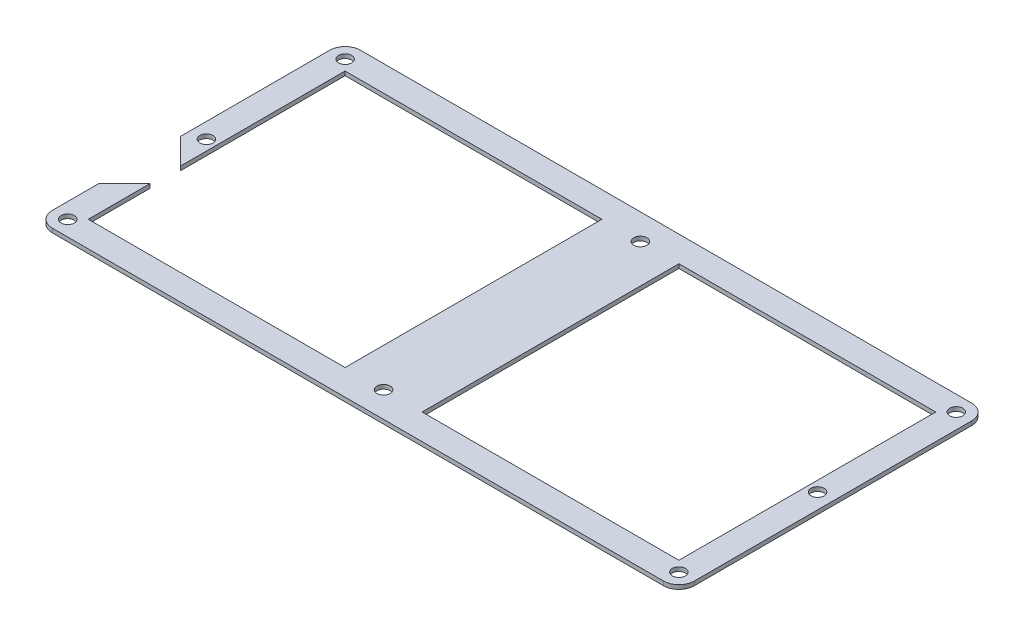
ISO-10303-21;
HEADER;
FILE_DESCRIPTION(('STEP AP214'),'2;1');
FILE_NAME('part.step','',(''),(''),'','','');
FILE_SCHEMA(('AUTOMOTIVE_DESIGN { 1 0 10303 214 1 1 1 1 }'));
ENDSEC;
DATA;
#1=APPLICATION_CONTEXT('core data for automotive mechanical design processes');
#2=APPLICATION_PROTOCOL_DEFINITION('international standard','automotive_design',2000,#1);
#3=PRODUCT_CONTEXT('',#1,'mechanical');
#4=PRODUCT('Part','Part','',(#3));
#5=PRODUCT_RELATED_PRODUCT_CATEGORY('part','',(#4));
#6=PRODUCT_DEFINITION_FORMATION('','',#4);
#7=PRODUCT_DEFINITION_CONTEXT('part definition',#1,'design');
#8=PRODUCT_DEFINITION('design','',#6,#7);
#9=PRODUCT_DEFINITION_SHAPE('','',#8);
#10=(LENGTH_UNIT() NAMED_UNIT(*) SI_UNIT(.MILLI.,.METRE.));
#11=(NAMED_UNIT(*) PLANE_ANGLE_UNIT() SI_UNIT($,.RADIAN.));
#12=(NAMED_UNIT(*) SI_UNIT($,.STERADIAN.) SOLID_ANGLE_UNIT());
#13=UNCERTAINTY_MEASURE_WITH_UNIT(LENGTH_MEASURE(1.E-05),#10,'distance_accuracy_value','');
#14=(GEOMETRIC_REPRESENTATION_CONTEXT(3) GLOBAL_UNCERTAINTY_ASSIGNED_CONTEXT((#13)) GLOBAL_UNIT_ASSIGNED_CONTEXT((#10,
#11,#12)) REPRESENTATION_CONTEXT('',''));
#15=CARTESIAN_POINT('',(0.,0.,0.));
#16=DIRECTION('',(0.,0.,1.));
#17=DIRECTION('',(1.,0.,0.));
#18=AXIS2_PLACEMENT_3D('',#15,#16,#17);
#19=CARTESIAN_POINT('',(19.4956943205761,1.6,-122.619803606918));
#20=DIRECTION('',(0.,1.,0.));
#21=DIRECTION('',(0.,0.,1.));
#22=AXIS2_PLACEMENT_3D('',#19,#20,#21);
#23=PLANE('',#22);
#24=CARTESIAN_POINT('',(257.495694320576,1.6,-68.6198036069182));
#25=DIRECTION('',(0.,1.,0.));
#26=DIRECTION('',(0.,0.,1.));
#27=AXIS2_PLACEMENT_3D('',#24,#25,#26);
#28=CIRCLE('',#27,2.55);
#29=CARTESIAN_POINT('',(257.495694320576,1.6,-66.0698036069182));
#30=VERTEX_POINT('',#29);
#31=EDGE_CURVE('E671',#30,#30,#28,.T.);
#32=ORIENTED_EDGE('',*,*,#31,.F.);
#33=EDGE_LOOP('',(#32));
#34=FACE_BOUND('',#33,.T.);
#35=CARTESIAN_POINT('',(257.495694320576,1.6,-14.6198036069181));
#36=DIRECTION('',(0.,1.,0.));
#37=DIRECTION('',(0.,0.,1.));
#38=AXIS2_PLACEMENT_3D('',#35,#36,#37);
#39=CIRCLE('',#38,2.5499999999995);
#40=CARTESIAN_POINT('',(257.495694320576,1.6,-12.0698036069186));
#41=VERTEX_POINT('',#40);
#42=EDGE_CURVE('E683',#41,#41,#39,.T.);
#43=ORIENTED_EDGE('',*,*,#42,.F.);
#44=EDGE_LOOP('',(#43));
#45=FACE_BOUND('',#44,.T.);
#46=CARTESIAN_POINT('',(138.495694320576,1.6,-118.619803606918));
#47=DIRECTION('',(0.,1.,0.));
#48=DIRECTION('',(0.,0.,1.));
#49=AXIS2_PLACEMENT_3D('',#46,#47,#48);
#50=CIRCLE('',#49,2.55);
#51=CARTESIAN_POINT('',(138.495694320576,1.6,-116.069803606918));
#52=VERTEX_POINT('',#51);
#53=EDGE_CURVE('E695',#52,#52,#50,.T.);
#54=ORIENTED_EDGE('',*,*,#53,.F.);
#55=EDGE_LOOP('',(#54));
#56=FACE_BOUND('',#55,.T.);
#57=CARTESIAN_POINT('',(19.4956943205761,1.6,-122.619803606918));
#58=DIRECTION('',(0.,1.,0.));
#59=DIRECTION('',(0.,0.,1.));
#60=AXIS2_PLACEMENT_3D('',#57,#58,#59);
#61=CIRCLE('',#60,2.55000000000046);
#62=CARTESIAN_POINT('',(19.4956943205761,1.6,-120.069803606918));
#63=VERTEX_POINT('',#62);
#64=EDGE_CURVE('E201',#63,#63,#61,.T.);
#65=ORIENTED_EDGE('',*,*,#64,.F.);
#66=EDGE_LOOP('',(#65));
#67=FACE_BOUND('',#66,.T.);
#68=DIRECTION('',(0.70710678118654,0.,0.707106781186555));
#69=VECTOR('',#68,1.);
#70=CARTESIAN_POINT('',(23.4956943205761,1.6,-54.6198036069181));
#71=LINE('',#70,#69);
#72=CARTESIAN_POINT('',(13.4956943205761,1.6,-64.6198036069184));
#73=VERTEX_POINT('',#72);
#74=CARTESIAN_POINT('',(23.4956943205761,1.6,-54.6198036069181));
#75=VERTEX_POINT('',#74);
#76=EDGE_CURVE('E211',#73,#75,#71,.T.);
#77=ORIENTED_EDGE('',*,*,#76,.T.);
#78=DIRECTION('',(0.,0.,-1.));
#79=VECTOR('',#78,1.);
#80=CARTESIAN_POINT('',(23.4956943205761,1.6,-54.6198036069181));
#81=LINE('',#80,#79);
#82=CARTESIAN_POINT('',(23.4956943205761,1.6,-118.619803606918));
#83=VERTEX_POINT('',#82);
#84=EDGE_CURVE('E214',#75,#83,#81,.T.);
#85=ORIENTED_EDGE('',*,*,#84,.T.);
#86=DIRECTION('',(1.,0.,0.));
#87=VECTOR('',#86,1.);
#88=CARTESIAN_POINT('',(23.4956943205761,1.6,-118.619803606918));
#89=LINE('',#88,#87);
#90=CARTESIAN_POINT('',(123.495694320576,1.6,-118.619803606918));
#91=VERTEX_POINT('',#90);
#92=EDGE_CURVE('E217',#83,#91,#89,.T.);
#93=ORIENTED_EDGE('',*,*,#92,.T.);
#94=DIRECTION('',(0.,0.,1.));
#95=VECTOR('',#94,1.);
#96=CARTESIAN_POINT('',(123.495694320576,1.6,-118.619803606918));
#97=LINE('',#96,#95);
#98=CARTESIAN_POINT('',(123.495694320576,1.6,-18.6198036069181));
#99=VERTEX_POINT('',#98);
#100=EDGE_CURVE('E219',#91,#99,#97,.T.);
#101=ORIENTED_EDGE('',*,*,#100,.T.);
#102=DIRECTION('',(-1.,0.,0.));
#103=VECTOR('',#102,1.);
#104=CARTESIAN_POINT('',(123.495694320576,1.6,-18.6198036069181));
#105=LINE('',#104,#103);
#106=CARTESIAN_POINT('',(23.4956943205761,1.6,-18.6198036069181));
#107=VERTEX_POINT('',#106);
#108=EDGE_CURVE('E221',#99,#107,#105,.T.);
#109=ORIENTED_EDGE('',*,*,#108,.T.);
#110=DIRECTION('',(0.,0.,-1.));
#111=VECTOR('',#110,1.);
#112=CARTESIAN_POINT('',(23.4956943205761,1.6,-18.6198036069181));
#113=LINE('',#112,#111);
#114=CARTESIAN_POINT('',(23.4956943205761,1.6,-42.6198036069181));
#115=VERTEX_POINT('',#114);
#116=EDGE_CURVE('E223',#107,#115,#113,.T.);
#117=ORIENTED_EDGE('',*,*,#116,.T.);
#118=DIRECTION('',(-0.70710678118654,0.,0.707106781186555));
#119=VECTOR('',#118,1.);
#120=CARTESIAN_POINT('',(23.4956943205761,1.6,-42.6198036069181));
#121=LINE('',#120,#119);
#122=CARTESIAN_POINT('',(13.4956943205761,1.6,-32.6198036069179));
#123=VERTEX_POINT('',#122);
#124=EDGE_CURVE('E225',#115,#123,#121,.T.);
#125=ORIENTED_EDGE('',*,*,#124,.T.);
#126=DIRECTION('',(0.,0.,1.));
#127=VECTOR('',#126,1.);
#128=CARTESIAN_POINT('',(13.4956943205761,1.6,-14.6198036069181));
#129=LINE('',#128,#127);
#130=CARTESIAN_POINT('',(13.4956943205762,1.6,-14.6198036069181));
#131=VERTEX_POINT('',#130);
#132=EDGE_CURVE('E227',#123,#131,#129,.T.);
#133=ORIENTED_EDGE('',*,*,#132,.T.);
#134=CARTESIAN_POINT('',(19.4956943205761,1.6,-14.6198036069181));
#135=DIRECTION('',(0.,1.,0.));
#136=DIRECTION('',(0.,0.,1.));
#137=AXIS2_PLACEMENT_3D('',#134,#135,#136);
#138=CIRCLE('',#137,6.);
#139=CARTESIAN_POINT('',(19.4956943205761,1.6,-8.61980360691814));
#140=VERTEX_POINT('',#139);
#141=EDGE_CURVE('E229',#131,#140,#138,.T.);
#142=ORIENTED_EDGE('',*,*,#141,.T.);
#143=DIRECTION('',(1.,0.,0.));
#144=VECTOR('',#143,1.);
#145=CARTESIAN_POINT('',(257.495694320576,1.6,-8.61980360691814));
#146=LINE('',#145,#144);
#147=CARTESIAN_POINT('',(257.495694320576,1.6,-8.61980360691814));
#148=VERTEX_POINT('',#147);
#149=EDGE_CURVE('E231',#140,#148,#146,.T.);
#150=ORIENTED_EDGE('',*,*,#149,.T.);
#151=CARTESIAN_POINT('',(257.495694320576,1.6,-14.6198036069181));
#152=DIRECTION('',(0.,1.,0.));
#153=DIRECTION('',(0.,0.,1.));
#154=AXIS2_PLACEMENT_3D('',#151,#152,#153);
#155=CIRCLE('',#154,6.);
#156=CARTESIAN_POINT('',(263.495694320576,1.6,-14.6198036069181));
#157=VERTEX_POINT('',#156);
#158=EDGE_CURVE('E233',#148,#157,#155,.T.);
#159=ORIENTED_EDGE('',*,*,#158,.T.);
#160=DIRECTION('',(0.,0.,-1.));
#161=VECTOR('',#160,1.);
#162=CARTESIAN_POINT('',(263.495694320576,1.6,-122.619803606918));
#163=LINE('',#162,#161);
#164=CARTESIAN_POINT('',(263.495694320576,1.6,-122.619803606918));
#165=VERTEX_POINT('',#164);
#166=EDGE_CURVE('E235',#157,#165,#163,.T.);
#167=ORIENTED_EDGE('',*,*,#166,.T.);
#168=CARTESIAN_POINT('',(257.495694320576,1.6,-122.619803606918));
#169=DIRECTION('',(0.,1.,0.));
#170=DIRECTION('',(0.,0.,1.));
#171=AXIS2_PLACEMENT_3D('',#168,#169,#170);
#172=CIRCLE('',#171,6.00000000000001);
#173=CARTESIAN_POINT('',(257.495694320576,1.6,-128.619803606918));
#174=VERTEX_POINT('',#173);
#175=EDGE_CURVE('E237',#165,#174,#172,.T.);
#176=ORIENTED_EDGE('',*,*,#175,.T.);
#177=DIRECTION('',(-1.,0.,0.));
#178=VECTOR('',#177,1.);
#179=CARTESIAN_POINT('',(19.4956943205761,1.6,-128.619803606918));
#180=LINE('',#179,#178);
#181=CARTESIAN_POINT('',(19.4956943205761,1.6,-128.619803606918));
#182=VERTEX_POINT('',#181);
#183=EDGE_CURVE('E239',#174,#182,#180,.T.);
#184=ORIENTED_EDGE('',*,*,#183,.T.);
#185=CARTESIAN_POINT('',(19.4956943205761,1.6,-122.619803606918));
#186=DIRECTION('',(0.,1.,0.));
#187=DIRECTION('',(0.,0.,1.));
#188=AXIS2_PLACEMENT_3D('',#185,#186,#187);
#189=CIRCLE('',#188,6.);
#190=CARTESIAN_POINT('',(13.4956943205761,1.6,-122.619803606918));
#191=VERTEX_POINT('',#190);
#192=EDGE_CURVE('E241',#182,#191,#189,.T.);
#193=ORIENTED_EDGE('',*,*,#192,.T.);
#194=DIRECTION('',(0.,0.,1.));
#195=VECTOR('',#194,1.);
#196=CARTESIAN_POINT('',(13.4956943205761,1.6,-64.6198036069184));
#197=LINE('',#196,#195);
#198=EDGE_CURVE('E243',#191,#73,#197,.T.);
#199=ORIENTED_EDGE('',*,*,#198,.T.);
#200=EDGE_LOOP('',(#77,#85,#93,#101,#109,#117,#125,#133,#142,#150,#159,#167,#176,#184,#193,#199));
#201=FACE_BOUND('',#200,.T.);
#202=DIRECTION('',(-1.,0.,0.));
#203=VECTOR('',#202,1.);
#204=CARTESIAN_POINT('',(253.495694320576,1.6,-118.619803606918));
#205=LINE('',#204,#203);
#206=CARTESIAN_POINT('',(253.495694320576,1.6,-118.619803606918));
#207=VERTEX_POINT('',#206);
#208=CARTESIAN_POINT('',(153.495694320576,1.6,-118.619803606918));
#209=VERTEX_POINT('',#208);
#210=EDGE_CURVE('E180',#207,#209,#205,.T.);
#211=ORIENTED_EDGE('',*,*,#210,.F.);
#212=DIRECTION('',(0.,0.,-1.));
#213=VECTOR('',#212,1.);
#214=CARTESIAN_POINT('',(253.495694320576,1.6,-18.6198036069181));
#215=LINE('',#214,#213);
#216=CARTESIAN_POINT('',(253.495694320576,1.6,-18.6198036069181));
#217=VERTEX_POINT('',#216);
#218=EDGE_CURVE('E172',#217,#207,#215,.T.);
#219=ORIENTED_EDGE('',*,*,#218,.F.);
#220=DIRECTION('',(1.,0.,0.));
#221=VECTOR('',#220,1.);
#222=CARTESIAN_POINT('',(153.495694320576,1.6,-18.6198036069181));
#223=LINE('',#222,#221);
#224=CARTESIAN_POINT('',(153.495694320576,1.6,-18.6198036069181));
#225=VERTEX_POINT('',#224);
#226=EDGE_CURVE('E195',#225,#217,#223,.T.);
#227=ORIENTED_EDGE('',*,*,#226,.F.);
#228=DIRECTION('',(0.,0.,1.));
#229=VECTOR('',#228,1.);
#230=CARTESIAN_POINT('',(153.495694320576,1.6,-118.619803606918));
#231=LINE('',#230,#229);
#232=EDGE_CURVE('E193',#209,#225,#231,.T.);
#233=ORIENTED_EDGE('',*,*,#232,.F.);
#234=EDGE_LOOP('',(#211,#219,#227,#233));
#235=FACE_BOUND('',#234,.T.);
#236=CARTESIAN_POINT('',(257.495694320576,1.6,-122.619803606918));
#237=DIRECTION('',(0.,1.,0.));
#238=DIRECTION('',(0.,0.,1.));
#239=AXIS2_PLACEMENT_3D('',#236,#237,#238);
#240=CIRCLE('',#239,2.5499999999995);
#241=CARTESIAN_POINT('',(257.495694320576,1.6,-120.069803606919));
#242=VERTEX_POINT('',#241);
#243=EDGE_CURVE('E701',#242,#242,#240,.T.);
#244=ORIENTED_EDGE('',*,*,#243,.F.);
#245=EDGE_LOOP('',(#244));
#246=FACE_BOUND('',#245,.T.);
#247=CARTESIAN_POINT('',(19.4956943205761,1.6,-14.6198036069181));
#248=DIRECTION('',(0.,1.,0.));
#249=DIRECTION('',(0.,0.,1.));
#250=AXIS2_PLACEMENT_3D('',#247,#248,#249);
#251=CIRCLE('',#250,2.55000000000045);
#252=CARTESIAN_POINT('',(19.4956943205761,1.6,-12.0698036069177));
#253=VERTEX_POINT('',#252);
#254=EDGE_CURVE('E689',#253,#253,#251,.T.);
#255=ORIENTED_EDGE('',*,*,#254,.F.);
#256=EDGE_LOOP('',(#255));
#257=FACE_BOUND('',#256,.T.);
#258=CARTESIAN_POINT('',(138.495694320576,1.6,-18.6198036069181));
#259=DIRECTION('',(0.,1.,0.));
#260=DIRECTION('',(0.,0.,1.));
#261=AXIS2_PLACEMENT_3D('',#258,#259,#260);
#262=CIRCLE('',#261,2.55);
#263=CARTESIAN_POINT('',(138.495694320576,1.6,-16.0698036069181));
#264=VERTEX_POINT('',#263);
#265=EDGE_CURVE('E677',#264,#264,#262,.T.);
#266=ORIENTED_EDGE('',*,*,#265,.F.);
#267=EDGE_LOOP('',(#266));
#268=FACE_BOUND('',#267,.T.);
#269=CARTESIAN_POINT('',(19.4956943205766,1.6,-68.6198036069182));
#270=DIRECTION('',(0.,1.,0.));
#271=DIRECTION('',(0.,0.,1.));
#272=AXIS2_PLACEMENT_3D('',#269,#270,#271);
#273=CIRCLE('',#272,2.55);
#274=CARTESIAN_POINT('',(19.4956943205766,1.6,-66.0698036069182));
#275=VERTEX_POINT('',#274);
#276=EDGE_CURVE('E662',#275,#275,#273,.T.);
#277=ORIENTED_EDGE('',*,*,#276,.F.);
#278=EDGE_LOOP('',(#277));
#279=FACE_BOUND('',#278,.T.);
#280=ADVANCED_FACE('F35',(#34,#45,#56,#67,#201,#235,#246,#257,#268,#279),#23,.T.);
#281=CARTESIAN_POINT('',(19.4956943205761,0.,-122.619803606918));
#282=DIRECTION('',(0.,1.,0.));
#283=DIRECTION('',(0.,0.,1.));
#284=AXIS2_PLACEMENT_3D('',#281,#282,#283);
#285=PLANE('',#284);
#286=DIRECTION('',(0.70710678118654,0.,0.707106781186555));
#287=VECTOR('',#286,1.);
#288=CARTESIAN_POINT('',(23.4956943205761,0.,-54.6198036069181));
#289=LINE('',#288,#287);
#290=CARTESIAN_POINT('',(13.4956943205761,0.,-64.6198036069184));
#291=VERTEX_POINT('',#290);
#292=CARTESIAN_POINT('',(23.4956943205761,0.,-54.6198036069181));
#293=VERTEX_POINT('',#292);
#294=EDGE_CURVE('E188',#291,#293,#289,.T.);
#295=ORIENTED_EDGE('',*,*,#294,.F.);
#296=DIRECTION('',(0.,0.,1.));
#297=VECTOR('',#296,1.);
#298=CARTESIAN_POINT('',(13.4956943205761,0.,-64.6198036069184));
#299=LINE('',#298,#297);
#300=CARTESIAN_POINT('',(13.4956943205761,0.,-122.619803606918));
#301=VERTEX_POINT('',#300);
#302=EDGE_CURVE('E215',#301,#291,#299,.T.);
#303=ORIENTED_EDGE('',*,*,#302,.F.);
#304=CARTESIAN_POINT('',(19.4956943205761,0.,-122.619803606918));
#305=DIRECTION('',(0.,1.,0.));
#306=DIRECTION('',(0.,0.,1.));
#307=AXIS2_PLACEMENT_3D('',#304,#305,#306);
#308=CIRCLE('',#307,6.);
#309=CARTESIAN_POINT('',(19.4956943205761,0.,-128.619803606918));
#310=VERTEX_POINT('',#309);
#311=EDGE_CURVE('E274',#310,#301,#308,.T.);
#312=ORIENTED_EDGE('',*,*,#311,.F.);
#313=DIRECTION('',(-1.,0.,0.));
#314=VECTOR('',#313,1.);
#315=CARTESIAN_POINT('',(19.4956943205761,0.,-128.619803606918));
#316=LINE('',#315,#314);
#317=CARTESIAN_POINT('',(257.495694320576,0.,-128.619803606918));
#318=VERTEX_POINT('',#317);
#319=EDGE_CURVE('E272',#318,#310,#316,.T.);
#320=ORIENTED_EDGE('',*,*,#319,.F.);
#321=CARTESIAN_POINT('',(257.495694320576,0.,-122.619803606918));
#322=DIRECTION('',(0.,1.,0.));
#323=DIRECTION('',(0.,0.,1.));
#324=AXIS2_PLACEMENT_3D('',#321,#322,#323);
#325=CIRCLE('',#324,6.00000000000001);
#326=CARTESIAN_POINT('',(263.495694320576,0.,-122.619803606918));
#327=VERTEX_POINT('',#326);
#328=EDGE_CURVE('E270',#327,#318,#325,.T.);
#329=ORIENTED_EDGE('',*,*,#328,.F.);
#330=DIRECTION('',(0.,0.,-1.));
#331=VECTOR('',#330,1.);
#332=CARTESIAN_POINT('',(263.495694320576,0.,-122.619803606918));
#333=LINE('',#332,#331);
#334=CARTESIAN_POINT('',(263.495694320576,0.,-14.6198036069181));
#335=VERTEX_POINT('',#334);
#336=EDGE_CURVE('E268',#335,#327,#333,.T.);
#337=ORIENTED_EDGE('',*,*,#336,.F.);
#338=CARTESIAN_POINT('',(257.495694320576,0.,-14.6198036069181));
#339=DIRECTION('',(0.,1.,0.));
#340=DIRECTION('',(0.,0.,1.));
#341=AXIS2_PLACEMENT_3D('',#338,#339,#340);
#342=CIRCLE('',#341,6.);
#343=CARTESIAN_POINT('',(257.495694320576,0.,-8.61980360691814));
#344=VERTEX_POINT('',#343);
#345=EDGE_CURVE('E266',#344,#335,#342,.T.);
#346=ORIENTED_EDGE('',*,*,#345,.F.);
#347=DIRECTION('',(1.,0.,0.));
#348=VECTOR('',#347,1.);
#349=CARTESIAN_POINT('',(257.495694320576,0.,-8.61980360691814));
#350=LINE('',#349,#348);
#351=CARTESIAN_POINT('',(19.4956943205761,0.,-8.61980360691814));
#352=VERTEX_POINT('',#351);
#353=EDGE_CURVE('E264',#352,#344,#350,.T.);
#354=ORIENTED_EDGE('',*,*,#353,.F.);
#355=CARTESIAN_POINT('',(19.4956943205761,0.,-14.6198036069181));
#356=DIRECTION('',(0.,1.,0.));
#357=DIRECTION('',(0.,0.,1.));
#358=AXIS2_PLACEMENT_3D('',#355,#356,#357);
#359=CIRCLE('',#358,6.);
#360=CARTESIAN_POINT('',(13.4956943205762,0.,-14.6198036069181));
#361=VERTEX_POINT('',#360);
#362=EDGE_CURVE('E262',#361,#352,#359,.T.);
#363=ORIENTED_EDGE('',*,*,#362,.F.);
#364=DIRECTION('',(0.,0.,1.));
#365=VECTOR('',#364,1.);
#366=CARTESIAN_POINT('',(13.4956943205761,0.,-14.6198036069181));
#367=LINE('',#366,#365);
#368=CARTESIAN_POINT('',(13.4956943205761,0.,-32.6198036069179));
#369=VERTEX_POINT('',#368);
#370=EDGE_CURVE('E260',#369,#361,#367,.T.);
#371=ORIENTED_EDGE('',*,*,#370,.F.);
#372=DIRECTION('',(-0.70710678118654,0.,0.707106781186555));
#373=VECTOR('',#372,1.);
#374=CARTESIAN_POINT('',(23.4956943205761,0.,-42.6198036069181));
#375=LINE('',#374,#373);
#376=CARTESIAN_POINT('',(23.4956943205761,0.,-42.6198036069181));
#377=VERTEX_POINT('',#376);
#378=EDGE_CURVE('E258',#377,#369,#375,.T.);
#379=ORIENTED_EDGE('',*,*,#378,.F.);
#380=DIRECTION('',(0.,0.,-1.));
#381=VECTOR('',#380,1.);
#382=CARTESIAN_POINT('',(23.4956943205761,0.,-18.6198036069181));
#383=LINE('',#382,#381);
#384=CARTESIAN_POINT('',(23.4956943205761,0.,-18.6198036069181));
#385=VERTEX_POINT('',#384);
#386=EDGE_CURVE('E256',#385,#377,#383,.T.);
#387=ORIENTED_EDGE('',*,*,#386,.F.);
#388=DIRECTION('',(-1.,0.,0.));
#389=VECTOR('',#388,1.);
#390=CARTESIAN_POINT('',(123.495694320576,0.,-18.6198036069181));
#391=LINE('',#390,#389);
#392=CARTESIAN_POINT('',(123.495694320576,0.,-18.6198036069181));
#393=VERTEX_POINT('',#392);
#394=EDGE_CURVE('E254',#393,#385,#391,.T.);
#395=ORIENTED_EDGE('',*,*,#394,.F.);
#396=DIRECTION('',(0.,0.,1.));
#397=VECTOR('',#396,1.);
#398=CARTESIAN_POINT('',(123.495694320576,0.,-118.619803606918));
#399=LINE('',#398,#397);
#400=CARTESIAN_POINT('',(123.495694320576,0.,-118.619803606918));
#401=VERTEX_POINT('',#400);
#402=EDGE_CURVE('E252',#401,#393,#399,.T.);
#403=ORIENTED_EDGE('',*,*,#402,.F.);
#404=DIRECTION('',(1.,0.,0.));
#405=VECTOR('',#404,1.);
#406=CARTESIAN_POINT('',(23.4956943205761,0.,-118.619803606918));
#407=LINE('',#406,#405);
#408=CARTESIAN_POINT('',(23.4956943205761,0.,-118.619803606918));
#409=VERTEX_POINT('',#408);
#410=EDGE_CURVE('E250',#409,#401,#407,.T.);
#411=ORIENTED_EDGE('',*,*,#410,.F.);
#412=DIRECTION('',(0.,0.,-1.));
#413=VECTOR('',#412,1.);
#414=CARTESIAN_POINT('',(23.4956943205761,0.,-54.6198036069181));
#415=LINE('',#414,#413);
#416=EDGE_CURVE('E248',#293,#409,#415,.T.);
#417=ORIENTED_EDGE('',*,*,#416,.F.);
#418=EDGE_LOOP('',(#295,#303,#312,#320,#329,#337,#346,#354,#363,#371,#379,#387,#395,#403,#411,#417));
#419=FACE_BOUND('',#418,.T.);
#420=DIRECTION('',(0.,0.,-1.));
#421=VECTOR('',#420,1.);
#422=CARTESIAN_POINT('',(253.495694320576,0.,-18.6198036069181));
#423=LINE('',#422,#421);
#424=CARTESIAN_POINT('',(253.495694320576,0.,-18.6198036069181));
#425=VERTEX_POINT('',#424);
#426=CARTESIAN_POINT('',(253.495694320576,0.,-118.619803606918));
#427=VERTEX_POINT('',#426);
#428=EDGE_CURVE('E58',#425,#427,#423,.T.);
#429=ORIENTED_EDGE('',*,*,#428,.T.);
#430=DIRECTION('',(-1.,0.,0.));
#431=VECTOR('',#430,1.);
#432=CARTESIAN_POINT('',(253.495694320576,0.,-118.619803606918));
#433=LINE('',#432,#431);
#434=CARTESIAN_POINT('',(153.495694320576,0.,-118.619803606918));
#435=VERTEX_POINT('',#434);
#436=EDGE_CURVE('E187',#427,#435,#433,.T.);
#437=ORIENTED_EDGE('',*,*,#436,.T.);
#438=DIRECTION('',(0.,0.,1.));
#439=VECTOR('',#438,1.);
#440=CARTESIAN_POINT('',(153.495694320576,0.,-118.619803606918));
#441=LINE('',#440,#439);
#442=CARTESIAN_POINT('',(153.495694320576,0.,-18.6198036069181));
#443=VERTEX_POINT('',#442);
#444=EDGE_CURVE('E203',#435,#443,#441,.T.);
#445=ORIENTED_EDGE('',*,*,#444,.T.);
#446=DIRECTION('',(1.,0.,0.));
#447=VECTOR('',#446,1.);
#448=CARTESIAN_POINT('',(153.495694320576,0.,-18.6198036069181));
#449=LINE('',#448,#447);
#450=EDGE_CURVE('E181',#443,#425,#449,.T.);
#451=ORIENTED_EDGE('',*,*,#450,.T.);
#452=EDGE_LOOP('',(#429,#437,#445,#451));
#453=FACE_BOUND('',#452,.T.);
#454=CARTESIAN_POINT('',(19.4956943205761,0.,-122.619803606918));
#455=DIRECTION('',(0.,1.,0.));
#456=DIRECTION('',(0.,0.,1.));
#457=AXIS2_PLACEMENT_3D('',#454,#455,#456);
#458=CIRCLE('',#457,2.55000000000046);
#459=CARTESIAN_POINT('',(19.4956943205761,0.,-120.069803606918));
#460=VERTEX_POINT('',#459);
#461=EDGE_CURVE('E704',#460,#460,#458,.T.);
#462=ORIENTED_EDGE('',*,*,#461,.T.);
#463=EDGE_LOOP('',(#462));
#464=FACE_BOUND('',#463,.T.);
#465=CARTESIAN_POINT('',(257.495694320576,0.,-122.619803606918));
#466=DIRECTION('',(0.,1.,0.));
#467=DIRECTION('',(0.,0.,1.));
#468=AXIS2_PLACEMENT_3D('',#465,#466,#467);
#469=CIRCLE('',#468,2.5499999999995);
#470=CARTESIAN_POINT('',(257.495694320576,0.,-120.069803606919));
#471=VERTEX_POINT('',#470);
#472=EDGE_CURVE('E698',#471,#471,#469,.T.);
#473=ORIENTED_EDGE('',*,*,#472,.T.);
#474=EDGE_LOOP('',(#473));
#475=FACE_BOUND('',#474,.T.);
#476=CARTESIAN_POINT('',(138.495694320576,0.,-118.619803606918));
#477=DIRECTION('',(0.,1.,0.));
#478=DIRECTION('',(0.,0.,1.));
#479=AXIS2_PLACEMENT_3D('',#476,#477,#478);
#480=CIRCLE('',#479,2.55);
#481=CARTESIAN_POINT('',(138.495694320576,0.,-116.069803606918));
#482=VERTEX_POINT('',#481);
#483=EDGE_CURVE('E692',#482,#482,#480,.T.);
#484=ORIENTED_EDGE('',*,*,#483,.T.);
#485=EDGE_LOOP('',(#484));
#486=FACE_BOUND('',#485,.T.);
#487=CARTESIAN_POINT('',(19.4956943205761,0.,-14.6198036069181));
#488=DIRECTION('',(0.,1.,0.));
#489=DIRECTION('',(0.,0.,1.));
#490=AXIS2_PLACEMENT_3D('',#487,#488,#489);
#491=CIRCLE('',#490,2.55000000000045);
#492=CARTESIAN_POINT('',(19.4956943205761,0.,-12.0698036069177));
#493=VERTEX_POINT('',#492);
#494=EDGE_CURVE('E686',#493,#493,#491,.T.);
#495=ORIENTED_EDGE('',*,*,#494,.T.);
#496=EDGE_LOOP('',(#495));
#497=FACE_BOUND('',#496,.T.);
#498=CARTESIAN_POINT('',(257.495694320576,0.,-14.6198036069181));
#499=DIRECTION('',(0.,1.,0.));
#500=DIRECTION('',(0.,0.,1.));
#501=AXIS2_PLACEMENT_3D('',#498,#499,#500);
#502=CIRCLE('',#501,2.5499999999995);
#503=CARTESIAN_POINT('',(257.495694320576,0.,-12.0698036069186));
#504=VERTEX_POINT('',#503);
#505=EDGE_CURVE('E680',#504,#504,#502,.T.);
#506=ORIENTED_EDGE('',*,*,#505,.T.);
#507=EDGE_LOOP('',(#506));
#508=FACE_BOUND('',#507,.T.);
#509=CARTESIAN_POINT('',(138.495694320576,0.,-18.6198036069181));
#510=DIRECTION('',(0.,1.,0.));
#511=DIRECTION('',(0.,0.,1.));
#512=AXIS2_PLACEMENT_3D('',#509,#510,#511);
#513=CIRCLE('',#512,2.55);
#514=CARTESIAN_POINT('',(138.495694320576,0.,-16.0698036069181));
#515=VERTEX_POINT('',#514);
#516=EDGE_CURVE('E674',#515,#515,#513,.T.);
#517=ORIENTED_EDGE('',*,*,#516,.T.);
#518=EDGE_LOOP('',(#517));
#519=FACE_BOUND('',#518,.T.);
#520=CARTESIAN_POINT('',(257.495694320576,0.,-68.6198036069182));
#521=DIRECTION('',(0.,1.,0.));
#522=DIRECTION('',(0.,0.,1.));
#523=AXIS2_PLACEMENT_3D('',#520,#521,#522);
#524=CIRCLE('',#523,2.55);
#525=CARTESIAN_POINT('',(257.495694320576,0.,-66.0698036069182));
#526=VERTEX_POINT('',#525);
#527=EDGE_CURVE('E668',#526,#526,#524,.T.);
#528=ORIENTED_EDGE('',*,*,#527,.T.);
#529=EDGE_LOOP('',(#528));
#530=FACE_BOUND('',#529,.T.);
#531=CARTESIAN_POINT('',(19.4956943205766,0.,-68.6198036069182));
#532=DIRECTION('',(0.,1.,0.));
#533=DIRECTION('',(0.,0.,1.));
#534=AXIS2_PLACEMENT_3D('',#531,#532,#533);
#535=CIRCLE('',#534,2.55);
#536=CARTESIAN_POINT('',(19.4956943205766,0.,-66.0698036069182));
#537=VERTEX_POINT('',#536);
#538=EDGE_CURVE('E665',#537,#537,#535,.T.);
#539=ORIENTED_EDGE('',*,*,#538,.T.);
#540=EDGE_LOOP('',(#539));
#541=FACE_BOUND('',#540,.T.);
#542=ADVANCED_FACE('F328',(#419,#453,#464,#475,#486,#497,#508,#519,#530,#541),#285,.F.);
#543=CARTESIAN_POINT('',(23.4956943205761,1.6,-54.6198036069181));
#544=DIRECTION('',(0.707106781186555,0.,-0.70710678118654));
#545=DIRECTION('',(-0.70710678118654,0.,-0.707106781186555));
#546=AXIS2_PLACEMENT_3D('',#543,#544,#545);
#547=PLANE('',#546);
#548=ORIENTED_EDGE('',*,*,#294,.T.);
#549=DIRECTION('',(0.,-1.,0.));
#550=VECTOR('',#549,1.);
#551=CARTESIAN_POINT('',(23.4956943205761,1.6,-54.6198036069181));
#552=LINE('',#551,#550);
#553=EDGE_CURVE('E11',#75,#293,#552,.T.);
#554=ORIENTED_EDGE('',*,*,#553,.F.);
#555=ORIENTED_EDGE('',*,*,#76,.F.);
#556=DIRECTION('',(0.,-1.,0.));
#557=VECTOR('',#556,1.);
#558=CARTESIAN_POINT('',(13.4956943205761,1.6,-64.6198036069184));
#559=LINE('',#558,#557);
#560=EDGE_CURVE('E245',#73,#291,#559,.T.);
#561=ORIENTED_EDGE('',*,*,#560,.T.);
#562=EDGE_LOOP('',(#548,#554,#555,#561));
#563=FACE_BOUND('',#562,.T.);
#564=ADVANCED_FACE('F37',(#563),#547,.F.);
#565=CARTESIAN_POINT('',(23.4956943205761,1.6,-54.6198036069181));
#566=DIRECTION('',(-1.,0.,0.));
#567=DIRECTION('',(0.,0.,1.));
#568=AXIS2_PLACEMENT_3D('',#565,#566,#567);
#569=PLANE('',#568);
#570=ORIENTED_EDGE('',*,*,#416,.T.);
#571=DIRECTION('',(0.,-1.,0.));
#572=VECTOR('',#571,1.);
#573=CARTESIAN_POINT('',(23.4956943205761,1.6,-118.619803606918));
#574=LINE('',#573,#572);
#575=EDGE_CURVE('E43',#83,#409,#574,.T.);
#576=ORIENTED_EDGE('',*,*,#575,.F.);
#577=ORIENTED_EDGE('',*,*,#84,.F.);
#578=ORIENTED_EDGE('',*,*,#553,.T.);
#579=EDGE_LOOP('',(#570,#576,#577,#578));
#580=FACE_BOUND('',#579,.T.);
#581=ADVANCED_FACE('F345',(#580),#569,.F.);
#582=CARTESIAN_POINT('',(23.4956943205761,1.6,-118.619803606918));
#583=DIRECTION('',(0.,0.,-1.));
#584=DIRECTION('',(-1.,0.,0.));
#585=AXIS2_PLACEMENT_3D('',#582,#583,#584);
#586=PLANE('',#585);
#587=ORIENTED_EDGE('',*,*,#410,.T.);
#588=DIRECTION('',(0.,-1.,0.));
#589=VECTOR('',#588,1.);
#590=CARTESIAN_POINT('',(123.495694320576,1.6,-118.619803606918));
#591=LINE('',#590,#589);
#592=EDGE_CURVE('E315',#91,#401,#591,.T.);
#593=ORIENTED_EDGE('',*,*,#592,.F.);
#594=ORIENTED_EDGE('',*,*,#92,.F.);
#595=ORIENTED_EDGE('',*,*,#575,.T.);
#596=EDGE_LOOP('',(#587,#593,#594,#595));
#597=FACE_BOUND('',#596,.T.);
#598=ADVANCED_FACE('F322',(#597),#586,.F.);
#599=CARTESIAN_POINT('',(123.495694320576,1.6,-118.619803606918));
#600=DIRECTION('',(1.,0.,0.));
#601=DIRECTION('',(0.,0.,-1.));
#602=AXIS2_PLACEMENT_3D('',#599,#600,#601);
#603=PLANE('',#602);
#604=ORIENTED_EDGE('',*,*,#402,.T.);
#605=DIRECTION('',(0.,-1.,0.));
#606=VECTOR('',#605,1.);
#607=CARTESIAN_POINT('',(123.495694320576,1.6,-18.6198036069181));
#608=LINE('',#607,#606);
#609=EDGE_CURVE('E312',#99,#393,#608,.T.);
#610=ORIENTED_EDGE('',*,*,#609,.F.);
#611=ORIENTED_EDGE('',*,*,#100,.F.);
#612=ORIENTED_EDGE('',*,*,#592,.T.);
#613=EDGE_LOOP('',(#604,#610,#611,#612));
#614=FACE_BOUND('',#613,.T.);
#615=ADVANCED_FACE('F334',(#614),#603,.F.);
#616=CARTESIAN_POINT('',(123.495694320576,1.6,-18.6198036069181));
#617=DIRECTION('',(0.,0.,1.));
#618=DIRECTION('',(1.,0.,0.));
#619=AXIS2_PLACEMENT_3D('',#616,#617,#618);
#620=PLANE('',#619);
#621=ORIENTED_EDGE('',*,*,#394,.T.);
#622=DIRECTION('',(0.,-1.,0.));
#623=VECTOR('',#622,1.);
#624=CARTESIAN_POINT('',(23.4956943205761,1.6,-18.6198036069181));
#625=LINE('',#624,#623);
#626=EDGE_CURVE('E309',#107,#385,#625,.T.);
#627=ORIENTED_EDGE('',*,*,#626,.F.);
#628=ORIENTED_EDGE('',*,*,#108,.F.);
#629=ORIENTED_EDGE('',*,*,#609,.T.);
#630=EDGE_LOOP('',(#621,#627,#628,#629));
#631=FACE_BOUND('',#630,.T.);
#632=ADVANCED_FACE('F338',(#631),#620,.F.);
#633=CARTESIAN_POINT('',(23.4956943205761,1.6,-18.6198036069181));
#634=DIRECTION('',(-1.,0.,0.));
#635=DIRECTION('',(0.,0.,1.));
#636=AXIS2_PLACEMENT_3D('',#633,#634,#635);
#637=PLANE('',#636);
#638=ORIENTED_EDGE('',*,*,#386,.T.);
#639=DIRECTION('',(0.,-1.,0.));
#640=VECTOR('',#639,1.);
#641=CARTESIAN_POINT('',(23.4956943205761,1.6,-42.6198036069181));
#642=LINE('',#641,#640);
#643=EDGE_CURVE('E306',#115,#377,#642,.T.);
#644=ORIENTED_EDGE('',*,*,#643,.F.);
#645=ORIENTED_EDGE('',*,*,#116,.F.);
#646=ORIENTED_EDGE('',*,*,#626,.T.);
#647=EDGE_LOOP('',(#638,#644,#645,#646));
#648=FACE_BOUND('',#647,.T.);
#649=ADVANCED_FACE('F398',(#648),#637,.F.);
#650=CARTESIAN_POINT('',(23.4956943205761,1.6,-42.6198036069181));
#651=DIRECTION('',(0.707106781186555,0.,0.70710678118654));
#652=DIRECTION('',(0.70710678118654,0.,-0.707106781186555));
#653=AXIS2_PLACEMENT_3D('',#650,#651,#652);
#654=PLANE('',#653);
#655=ORIENTED_EDGE('',*,*,#378,.T.);
#656=DIRECTION('',(0.,-1.,0.));
#657=VECTOR('',#656,1.);
#658=CARTESIAN_POINT('',(13.4956943205761,1.6,-32.6198036069179));
#659=LINE('',#658,#657);
#660=EDGE_CURVE('E303',#123,#369,#659,.T.);
#661=ORIENTED_EDGE('',*,*,#660,.F.);
#662=ORIENTED_EDGE('',*,*,#124,.F.);
#663=ORIENTED_EDGE('',*,*,#643,.T.);
#664=EDGE_LOOP('',(#655,#661,#662,#663));
#665=FACE_BOUND('',#664,.T.);
#666=ADVANCED_FACE('F395',(#665),#654,.F.);
#667=CARTESIAN_POINT('',(13.4956943205761,1.6,-14.6198036069181));
#668=DIRECTION('',(1.,0.,0.));
#669=DIRECTION('',(0.,0.,-1.));
#670=AXIS2_PLACEMENT_3D('',#667,#668,#669);
#671=PLANE('',#670);
#672=ORIENTED_EDGE('',*,*,#370,.T.);
#673=DIRECTION('',(0.,-1.,0.));
#674=VECTOR('',#673,1.);
#675=CARTESIAN_POINT('',(13.4956943205762,1.6,-14.6198036069181));
#676=LINE('',#675,#674);
#677=EDGE_CURVE('E300',#131,#361,#676,.T.);
#678=ORIENTED_EDGE('',*,*,#677,.F.);
#679=ORIENTED_EDGE('',*,*,#132,.F.);
#680=ORIENTED_EDGE('',*,*,#660,.T.);
#681=EDGE_LOOP('',(#672,#678,#679,#680));
#682=FACE_BOUND('',#681,.T.);
#683=ADVANCED_FACE('F391',(#682),#671,.F.);
#684=CARTESIAN_POINT('',(19.4956943205761,1.6,-14.6198036069181));
#685=DIRECTION('',(0.,-1.,0.));
#686=DIRECTION('',(0.,0.,-1.));
#687=AXIS2_PLACEMENT_3D('',#684,#685,#686);
#688=CYLINDRICAL_SURFACE('',#687,6.);
#689=ORIENTED_EDGE('',*,*,#362,.T.);
#690=DIRECTION('',(0.,-1.,0.));
#691=VECTOR('',#690,1.);
#692=CARTESIAN_POINT('',(19.4956943205761,1.6,-8.61980360691814));
#693=LINE('',#692,#691);
#694=EDGE_CURVE('E297',#140,#352,#693,.T.);
#695=ORIENTED_EDGE('',*,*,#694,.F.);
#696=ORIENTED_EDGE('',*,*,#141,.F.);
#697=ORIENTED_EDGE('',*,*,#677,.T.);
#698=EDGE_LOOP('',(#689,#695,#696,#697));
#699=FACE_BOUND('',#698,.T.);
#700=ADVANCED_FACE('F387',(#699),#688,.T.);
#701=CARTESIAN_POINT('',(257.495694320576,1.6,-8.61980360691814));
#702=DIRECTION('',(0.,0.,-1.));
#703=DIRECTION('',(-1.,0.,0.));
#704=AXIS2_PLACEMENT_3D('',#701,#702,#703);
#705=PLANE('',#704);
#706=ORIENTED_EDGE('',*,*,#353,.T.);
#707=DIRECTION('',(0.,-1.,0.));
#708=VECTOR('',#707,1.);
#709=CARTESIAN_POINT('',(257.495694320576,1.6,-8.61980360691814));
#710=LINE('',#709,#708);
#711=EDGE_CURVE('E294',#148,#344,#710,.T.);
#712=ORIENTED_EDGE('',*,*,#711,.F.);
#713=ORIENTED_EDGE('',*,*,#149,.F.);
#714=ORIENTED_EDGE('',*,*,#694,.T.);
#715=EDGE_LOOP('',(#706,#712,#713,#714));
#716=FACE_BOUND('',#715,.T.);
#717=ADVANCED_FACE('F382',(#716),#705,.F.);
#718=CARTESIAN_POINT('',(257.495694320576,1.6,-14.6198036069181));
#719=DIRECTION('',(0.,-1.,0.));
#720=DIRECTION('',(0.,0.,-1.));
#721=AXIS2_PLACEMENT_3D('',#718,#719,#720);
#722=CYLINDRICAL_SURFACE('',#721,6.);
#723=ORIENTED_EDGE('',*,*,#345,.T.);
#724=DIRECTION('',(0.,-1.,0.));
#725=VECTOR('',#724,1.);
#726=CARTESIAN_POINT('',(263.495694320576,1.6,-14.6198036069181));
#727=LINE('',#726,#725);
#728=EDGE_CURVE('E291',#157,#335,#727,.T.);
#729=ORIENTED_EDGE('',*,*,#728,.F.);
#730=ORIENTED_EDGE('',*,*,#158,.F.);
#731=ORIENTED_EDGE('',*,*,#711,.T.);
#732=EDGE_LOOP('',(#723,#729,#730,#731));
#733=FACE_BOUND('',#732,.T.);
#734=ADVANCED_FACE('F376',(#733),#722,.T.);
#735=CARTESIAN_POINT('',(263.495694320576,1.6,-122.619803606918));
#736=DIRECTION('',(-1.,0.,0.));
#737=DIRECTION('',(0.,0.,1.));
#738=AXIS2_PLACEMENT_3D('',#735,#736,#737);
#739=PLANE('',#738);
#740=ORIENTED_EDGE('',*,*,#336,.T.);
#741=DIRECTION('',(0.,-1.,0.));
#742=VECTOR('',#741,1.);
#743=CARTESIAN_POINT('',(263.495694320576,1.6,-122.619803606918));
#744=LINE('',#743,#742);
#745=EDGE_CURVE('E288',#165,#327,#744,.T.);
#746=ORIENTED_EDGE('',*,*,#745,.F.);
#747=ORIENTED_EDGE('',*,*,#166,.F.);
#748=ORIENTED_EDGE('',*,*,#728,.T.);
#749=EDGE_LOOP('',(#740,#746,#747,#748));
#750=FACE_BOUND('',#749,.T.);
#751=ADVANCED_FACE('F372',(#750),#739,.F.);
#752=CARTESIAN_POINT('',(257.495694320576,1.6,-122.619803606918));
#753=DIRECTION('',(0.,-1.,0.));
#754=DIRECTION('',(0.,0.,-1.));
#755=AXIS2_PLACEMENT_3D('',#752,#753,#754);
#756=CYLINDRICAL_SURFACE('',#755,6.00000000000001);
#757=ORIENTED_EDGE('',*,*,#328,.T.);
#758=DIRECTION('',(0.,-1.,0.));
#759=VECTOR('',#758,1.);
#760=CARTESIAN_POINT('',(257.495694320576,1.6,-128.619803606918));
#761=LINE('',#760,#759);
#762=EDGE_CURVE('E285',#174,#318,#761,.T.);
#763=ORIENTED_EDGE('',*,*,#762,.F.);
#764=ORIENTED_EDGE('',*,*,#175,.F.);
#765=ORIENTED_EDGE('',*,*,#745,.T.);
#766=EDGE_LOOP('',(#757,#763,#764,#765));
#767=FACE_BOUND('',#766,.T.);
#768=ADVANCED_FACE('F367',(#767),#756,.T.);
#769=CARTESIAN_POINT('',(19.4956943205761,1.6,-128.619803606918));
#770=DIRECTION('',(0.,0.,1.));
#771=DIRECTION('',(1.,0.,0.));
#772=AXIS2_PLACEMENT_3D('',#769,#770,#771);
#773=PLANE('',#772);
#774=ORIENTED_EDGE('',*,*,#319,.T.);
#775=DIRECTION('',(0.,-1.,0.));
#776=VECTOR('',#775,1.);
#777=CARTESIAN_POINT('',(19.4956943205761,1.6,-128.619803606918));
#778=LINE('',#777,#776);
#779=EDGE_CURVE('E282',#182,#310,#778,.T.);
#780=ORIENTED_EDGE('',*,*,#779,.F.);
#781=ORIENTED_EDGE('',*,*,#183,.F.);
#782=ORIENTED_EDGE('',*,*,#762,.T.);
#783=EDGE_LOOP('',(#774,#780,#781,#782));
#784=FACE_BOUND('',#783,.T.);
#785=ADVANCED_FACE('F361',(#784),#773,.F.);
#786=CARTESIAN_POINT('',(19.4956943205761,1.6,-122.619803606918));
#787=DIRECTION('',(0.,-1.,0.));
#788=DIRECTION('',(0.,0.,-1.));
#789=AXIS2_PLACEMENT_3D('',#786,#787,#788);
#790=CYLINDRICAL_SURFACE('',#789,6.);
#791=ORIENTED_EDGE('',*,*,#311,.T.);
#792=DIRECTION('',(0.,-1.,0.));
#793=VECTOR('',#792,1.);
#794=CARTESIAN_POINT('',(13.4956943205761,1.6,-122.619803606918));
#795=LINE('',#794,#793);
#796=EDGE_CURVE('E279',#191,#301,#795,.T.);
#797=ORIENTED_EDGE('',*,*,#796,.F.);
#798=ORIENTED_EDGE('',*,*,#192,.F.);
#799=ORIENTED_EDGE('',*,*,#779,.T.);
#800=EDGE_LOOP('',(#791,#797,#798,#799));
#801=FACE_BOUND('',#800,.T.);
#802=ADVANCED_FACE('F357',(#801),#790,.T.);
#803=CARTESIAN_POINT('',(13.4956943205761,1.6,-64.6198036069184));
#804=DIRECTION('',(1.,0.,0.));
#805=DIRECTION('',(0.,0.,-1.));
#806=AXIS2_PLACEMENT_3D('',#803,#804,#805);
#807=PLANE('',#806);
#808=ORIENTED_EDGE('',*,*,#302,.T.);
#809=ORIENTED_EDGE('',*,*,#560,.F.);
#810=ORIENTED_EDGE('',*,*,#198,.F.);
#811=ORIENTED_EDGE('',*,*,#796,.T.);
#812=EDGE_LOOP('',(#808,#809,#810,#811));
#813=FACE_BOUND('',#812,.T.);
#814=ADVANCED_FACE('F352',(#813),#807,.F.);
#815=CARTESIAN_POINT('',(253.495694320576,1.6,-18.6198036069181));
#816=DIRECTION('',(-1.,0.,0.));
#817=DIRECTION('',(0.,0.,1.));
#818=AXIS2_PLACEMENT_3D('',#815,#816,#817);
#819=PLANE('',#818);
#820=ORIENTED_EDGE('',*,*,#428,.F.);
#821=DIRECTION('',(0.,-1.,0.));
#822=VECTOR('',#821,1.);
#823=CARTESIAN_POINT('',(253.495694320576,1.6,-18.6198036069181));
#824=LINE('',#823,#822);
#825=EDGE_CURVE('E176',#217,#425,#824,.T.);
#826=ORIENTED_EDGE('',*,*,#825,.F.);
#827=ORIENTED_EDGE('',*,*,#218,.T.);
#828=DIRECTION('',(0.,-1.,0.));
#829=VECTOR('',#828,1.);
#830=CARTESIAN_POINT('',(253.495694320576,1.6,-118.619803606918));
#831=LINE('',#830,#829);
#832=EDGE_CURVE('E175',#207,#427,#831,.T.);
#833=ORIENTED_EDGE('',*,*,#832,.T.);
#834=EDGE_LOOP('',(#820,#826,#827,#833));
#835=FACE_BOUND('',#834,.T.);
#836=ADVANCED_FACE('F174',(#835),#819,.T.);
#837=CARTESIAN_POINT('',(253.495694320576,1.6,-118.619803606918));
#838=DIRECTION('',(0.,0.,1.));
#839=DIRECTION('',(1.,0.,0.));
#840=AXIS2_PLACEMENT_3D('',#837,#838,#839);
#841=PLANE('',#840);
#842=ORIENTED_EDGE('',*,*,#436,.F.);
#843=ORIENTED_EDGE('',*,*,#832,.F.);
#844=ORIENTED_EDGE('',*,*,#210,.T.);
#845=DIRECTION('',(0.,-1.,0.));
#846=VECTOR('',#845,1.);
#847=CARTESIAN_POINT('',(153.495694320576,1.6,-118.619803606918));
#848=LINE('',#847,#846);
#849=EDGE_CURVE('E189',#209,#435,#848,.T.);
#850=ORIENTED_EDGE('',*,*,#849,.T.);
#851=EDGE_LOOP('',(#842,#843,#844,#850));
#852=FACE_BOUND('',#851,.T.);
#853=ADVANCED_FACE('F184',(#852),#841,.T.);
#854=CARTESIAN_POINT('',(153.495694320576,1.6,-118.619803606918));
#855=DIRECTION('',(1.,0.,0.));
#856=DIRECTION('',(0.,0.,-1.));
#857=AXIS2_PLACEMENT_3D('',#854,#855,#856);
#858=PLANE('',#857);
#859=ORIENTED_EDGE('',*,*,#444,.F.);
#860=ORIENTED_EDGE('',*,*,#849,.F.);
#861=ORIENTED_EDGE('',*,*,#232,.T.);
#862=DIRECTION('',(0.,-1.,0.));
#863=VECTOR('',#862,1.);
#864=CARTESIAN_POINT('',(153.495694320576,1.6,-18.6198036069181));
#865=LINE('',#864,#863);
#866=EDGE_CURVE('E50',#225,#443,#865,.T.);
#867=ORIENTED_EDGE('',*,*,#866,.T.);
#868=EDGE_LOOP('',(#859,#860,#861,#867));
#869=FACE_BOUND('',#868,.T.);
#870=ADVANCED_FACE('F483',(#869),#858,.T.);
#871=CARTESIAN_POINT('',(153.495694320576,1.6,-18.6198036069181));
#872=DIRECTION('',(0.,0.,-1.));
#873=DIRECTION('',(-1.,0.,0.));
#874=AXIS2_PLACEMENT_3D('',#871,#872,#873);
#875=PLANE('',#874);
#876=ORIENTED_EDGE('',*,*,#450,.F.);
#877=ORIENTED_EDGE('',*,*,#866,.F.);
#878=ORIENTED_EDGE('',*,*,#226,.T.);
#879=ORIENTED_EDGE('',*,*,#825,.T.);
#880=EDGE_LOOP('',(#876,#877,#878,#879));
#881=FACE_BOUND('',#880,.T.);
#882=ADVANCED_FACE('F489',(#881),#875,.T.);
#883=CARTESIAN_POINT('',(19.4956943205761,1.6,-122.619803606918));
#884=DIRECTION('',(0.,-1.,0.));
#885=DIRECTION('',(0.,0.,-1.));
#886=AXIS2_PLACEMENT_3D('',#883,#884,#885);
#887=CYLINDRICAL_SURFACE('',#886,2.55000000000046);
#888=ORIENTED_EDGE('',*,*,#64,.T.);
#889=EDGE_LOOP('',(#888));
#890=FACE_BOUND('',#889,.T.);
#891=ORIENTED_EDGE('',*,*,#461,.F.);
#892=EDGE_LOOP('',(#891));
#893=FACE_BOUND('',#892,.T.);
#894=ADVANCED_FACE('F497',(#890,#893),#887,.F.);
#895=CARTESIAN_POINT('',(257.495694320576,1.6,-122.619803606918));
#896=DIRECTION('',(0.,-1.,0.));
#897=DIRECTION('',(0.,0.,-1.));
#898=AXIS2_PLACEMENT_3D('',#895,#896,#897);
#899=CYLINDRICAL_SURFACE('',#898,2.5499999999995);
#900=ORIENTED_EDGE('',*,*,#243,.T.);
#901=EDGE_LOOP('',(#900));
#902=FACE_BOUND('',#901,.T.);
#903=ORIENTED_EDGE('',*,*,#472,.F.);
#904=EDGE_LOOP('',(#903));
#905=FACE_BOUND('',#904,.T.);
#906=ADVANCED_FACE('F504',(#902,#905),#899,.F.);
#907=CARTESIAN_POINT('',(138.495694320576,1.6,-118.619803606918));
#908=DIRECTION('',(0.,-1.,0.));
#909=DIRECTION('',(0.,0.,-1.));
#910=AXIS2_PLACEMENT_3D('',#907,#908,#909);
#911=CYLINDRICAL_SURFACE('',#910,2.55);
#912=ORIENTED_EDGE('',*,*,#53,.T.);
#913=EDGE_LOOP('',(#912));
#914=FACE_BOUND('',#913,.T.);
#915=ORIENTED_EDGE('',*,*,#483,.F.);
#916=EDGE_LOOP('',(#915));
#917=FACE_BOUND('',#916,.T.);
#918=ADVANCED_FACE('F512',(#914,#917),#911,.F.);
#919=CARTESIAN_POINT('',(19.4956943205761,1.6,-14.6198036069181));
#920=DIRECTION('',(0.,-1.,0.));
#921=DIRECTION('',(0.,0.,-1.));
#922=AXIS2_PLACEMENT_3D('',#919,#920,#921);
#923=CYLINDRICAL_SURFACE('',#922,2.55000000000045);
#924=ORIENTED_EDGE('',*,*,#254,.T.);
#925=EDGE_LOOP('',(#924));
#926=FACE_BOUND('',#925,.T.);
#927=ORIENTED_EDGE('',*,*,#494,.F.);
#928=EDGE_LOOP('',(#927));
#929=FACE_BOUND('',#928,.T.);
#930=ADVANCED_FACE('F520',(#926,#929),#923,.F.);
#931=CARTESIAN_POINT('',(257.495694320576,1.6,-14.6198036069181));
#932=DIRECTION('',(0.,-1.,0.));
#933=DIRECTION('',(0.,0.,-1.));
#934=AXIS2_PLACEMENT_3D('',#931,#932,#933);
#935=CYLINDRICAL_SURFACE('',#934,2.5499999999995);
#936=ORIENTED_EDGE('',*,*,#42,.T.);
#937=EDGE_LOOP('',(#936));
#938=FACE_BOUND('',#937,.T.);
#939=ORIENTED_EDGE('',*,*,#505,.F.);
#940=EDGE_LOOP('',(#939));
#941=FACE_BOUND('',#940,.T.);
#942=ADVANCED_FACE('F528',(#938,#941),#935,.F.);
#943=CARTESIAN_POINT('',(138.495694320576,1.6,-18.6198036069181));
#944=DIRECTION('',(0.,-1.,0.));
#945=DIRECTION('',(0.,0.,-1.));
#946=AXIS2_PLACEMENT_3D('',#943,#944,#945);
#947=CYLINDRICAL_SURFACE('',#946,2.55);
#948=ORIENTED_EDGE('',*,*,#265,.T.);
#949=EDGE_LOOP('',(#948));
#950=FACE_BOUND('',#949,.T.);
#951=ORIENTED_EDGE('',*,*,#516,.F.);
#952=EDGE_LOOP('',(#951));
#953=FACE_BOUND('',#952,.T.);
#954=ADVANCED_FACE('F536',(#950,#953),#947,.F.);
#955=CARTESIAN_POINT('',(257.495694320576,1.6,-68.6198036069182));
#956=DIRECTION('',(0.,-1.,0.));
#957=DIRECTION('',(0.,0.,-1.));
#958=AXIS2_PLACEMENT_3D('',#955,#956,#957);
#959=CYLINDRICAL_SURFACE('',#958,2.55);
#960=ORIENTED_EDGE('',*,*,#31,.T.);
#961=EDGE_LOOP('',(#960));
#962=FACE_BOUND('',#961,.T.);
#963=ORIENTED_EDGE('',*,*,#527,.F.);
#964=EDGE_LOOP('',(#963));
#965=FACE_BOUND('',#964,.T.);
#966=ADVANCED_FACE('F544',(#962,#965),#959,.F.);
#967=CARTESIAN_POINT('',(19.4956943205766,1.6,-68.6198036069182));
#968=DIRECTION('',(0.,-1.,0.));
#969=DIRECTION('',(0.,0.,-1.));
#970=AXIS2_PLACEMENT_3D('',#967,#968,#969);
#971=CYLINDRICAL_SURFACE('',#970,2.55);
#972=ORIENTED_EDGE('',*,*,#276,.T.);
#973=EDGE_LOOP('',(#972));
#974=FACE_BOUND('',#973,.T.);
#975=ORIENTED_EDGE('',*,*,#538,.F.);
#976=EDGE_LOOP('',(#975));
#977=FACE_BOUND('',#976,.T.);
#978=ADVANCED_FACE('F552',(#974,#977),#971,.F.);
#979=CLOSED_SHELL('',(#280,#542,#564,#581,#598,#615,#632,#649,#666,#683,#700,#717,#734,#751,
#768,#785,#802,#814,#836,#853,#870,#882,#894,#906,#918,#930,#942,#954,#966,#978));
#980=MANIFOLD_SOLID_BREP('B2',#979);
#981=ADVANCED_BREP_SHAPE_REPRESENTATION('',(#18,#980),#14);
#982=SHAPE_DEFINITION_REPRESENTATION(#9,#981);
ENDSEC;
END-ISO-10303-21;
